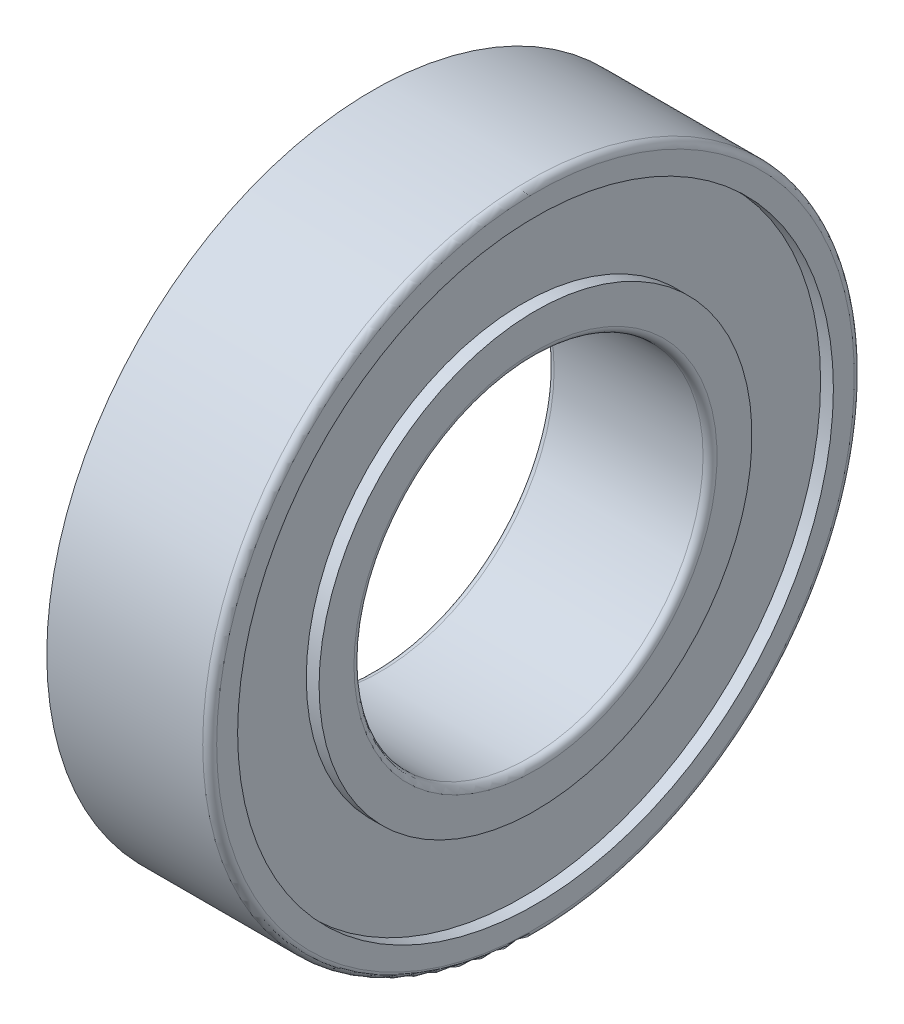
ISO-10303-21;
HEADER;
FILE_DESCRIPTION(('STEP AP214'),'2;1');
FILE_NAME('part.step','',(''),(''),'','','');
FILE_SCHEMA(('AUTOMOTIVE_DESIGN { 1 0 10303 214 1 1 1 1 }'));
ENDSEC;
DATA;
#1=APPLICATION_CONTEXT('core data for automotive mechanical design processes');
#2=APPLICATION_PROTOCOL_DEFINITION('international standard','automotive_design',2000,#1);
#3=PRODUCT_CONTEXT('',#1,'mechanical');
#4=PRODUCT('Part','Part','',(#3));
#5=PRODUCT_RELATED_PRODUCT_CATEGORY('part','',(#4));
#6=PRODUCT_DEFINITION_FORMATION('','',#4);
#7=PRODUCT_DEFINITION_CONTEXT('part definition',#1,'design');
#8=PRODUCT_DEFINITION('design','',#6,#7);
#9=PRODUCT_DEFINITION_SHAPE('','',#8);
#10=(LENGTH_UNIT() NAMED_UNIT(*) SI_UNIT(.MILLI.,.METRE.));
#11=(NAMED_UNIT(*) PLANE_ANGLE_UNIT() SI_UNIT($,.RADIAN.));
#12=(NAMED_UNIT(*) SI_UNIT($,.STERADIAN.) SOLID_ANGLE_UNIT());
#13=UNCERTAINTY_MEASURE_WITH_UNIT(LENGTH_MEASURE(1.E-05),#10,'distance_accuracy_value','');
#14=(GEOMETRIC_REPRESENTATION_CONTEXT(3) GLOBAL_UNCERTAINTY_ASSIGNED_CONTEXT((#13)) GLOBAL_UNIT_ASSIGNED_CONTEXT((#10,
#11,#12)) REPRESENTATION_CONTEXT('',''));
#15=CARTESIAN_POINT('',(0.,0.,0.));
#16=DIRECTION('',(0.,0.,1.));
#17=DIRECTION('',(1.,0.,0.));
#18=AXIS2_PLACEMENT_3D('',#15,#16,#17);
#19=CARTESIAN_POINT('',(7.,0.,0.));
#20=DIRECTION('',(-1.,0.,0.));
#21=DIRECTION('',(0.,0.,1.));
#22=AXIS2_PLACEMENT_3D('',#19,#20,#21);
#23=CYLINDRICAL_SURFACE('',#22,14.);
#24=CARTESIAN_POINT('',(0.,0.,0.));
#25=DIRECTION('',(-1.,0.,0.));
#26=DIRECTION('',(0.,0.,1.));
#27=AXIS2_PLACEMENT_3D('',#24,#25,#26);
#28=CIRCLE('',#27,14.);
#29=CARTESIAN_POINT('',(0.,0.,14.));
#30=VERTEX_POINT('',#29);
#31=EDGE_CURVE('E10',#30,#30,#28,.T.);
#32=ORIENTED_EDGE('',*,*,#31,.F.);
#33=EDGE_LOOP('',(#32));
#34=FACE_BOUND('',#33,.T.);
#35=CARTESIAN_POINT('',(6.7,0.,0.));
#36=DIRECTION('',(-1.,0.,0.));
#37=DIRECTION('',(0.,0.,1.));
#38=AXIS2_PLACEMENT_3D('',#35,#36,#37);
#39=CIRCLE('',#38,14.);
#40=CARTESIAN_POINT('',(6.7,0.,14.));
#41=VERTEX_POINT('',#40);
#42=EDGE_CURVE('E88',#41,#41,#39,.T.);
#43=ORIENTED_EDGE('',*,*,#42,.T.);
#44=EDGE_LOOP('',(#43));
#45=FACE_BOUND('',#44,.T.);
#46=ADVANCED_FACE('F39',(#34,#45),#23,.T.);
#47=CARTESIAN_POINT('',(0.,14.,0.));
#48=DIRECTION('',(1.,0.,0.));
#49=DIRECTION('',(0.,0.,-1.));
#50=AXIS2_PLACEMENT_3D('',#47,#48,#49);
#51=PLANE('',#50);
#52=CARTESIAN_POINT('',(0.,0.,0.));
#53=DIRECTION('',(-1.,0.,0.));
#54=DIRECTION('',(0.,0.,1.));
#55=AXIS2_PLACEMENT_3D('',#52,#53,#54);
#56=CIRCLE('',#55,12.8);
#57=CARTESIAN_POINT('',(0.,0.,12.8));
#58=VERTEX_POINT('',#57);
#59=EDGE_CURVE('E44',#58,#58,#56,.T.);
#60=ORIENTED_EDGE('',*,*,#59,.F.);
#61=EDGE_LOOP('',(#60));
#62=FACE_BOUND('',#61,.T.);
#63=ORIENTED_EDGE('',*,*,#31,.T.);
#64=EDGE_LOOP('',(#63));
#65=FACE_BOUND('',#64,.T.);
#66=ADVANCED_FACE('F167',(#62,#65),#51,.F.);
#67=CARTESIAN_POINT('',(7.,0.,0.));
#68=DIRECTION('',(-1.,0.,0.));
#69=DIRECTION('',(0.,0.,1.));
#70=AXIS2_PLACEMENT_3D('',#67,#68,#69);
#71=CYLINDRICAL_SURFACE('',#70,12.8);
#72=CARTESIAN_POINT('',(0.55,0.,0.));
#73=DIRECTION('',(-1.,0.,0.));
#74=DIRECTION('',(0.,0.,1.));
#75=AXIS2_PLACEMENT_3D('',#72,#73,#74);
#76=CIRCLE('',#75,12.8);
#77=CARTESIAN_POINT('',(0.55,0.,12.8));
#78=VERTEX_POINT('',#77);
#79=EDGE_CURVE('E47',#78,#78,#76,.T.);
#80=ORIENTED_EDGE('',*,*,#79,.F.);
#81=EDGE_LOOP('',(#80));
#82=FACE_BOUND('',#81,.T.);
#83=ORIENTED_EDGE('',*,*,#59,.T.);
#84=EDGE_LOOP('',(#83));
#85=FACE_BOUND('',#84,.T.);
#86=ADVANCED_FACE('F164',(#82,#85),#71,.F.);
#87=CARTESIAN_POINT('',(0.55,12.8,0.));
#88=DIRECTION('',(1.,0.,0.));
#89=DIRECTION('',(0.,0.,-1.));
#90=AXIS2_PLACEMENT_3D('',#87,#88,#89);
#91=PLANE('',#90);
#92=CARTESIAN_POINT('',(0.55,0.,0.));
#93=DIRECTION('',(-1.,0.,0.));
#94=DIRECTION('',(0.,0.,1.));
#95=AXIS2_PLACEMENT_3D('',#92,#93,#94);
#96=CIRCLE('',#95,9.3);
#97=CARTESIAN_POINT('',(0.55,0.,9.3));
#98=VERTEX_POINT('',#97);
#99=EDGE_CURVE('E52',#98,#98,#96,.T.);
#100=ORIENTED_EDGE('',*,*,#99,.F.);
#101=EDGE_LOOP('',(#100));
#102=FACE_BOUND('',#101,.T.);
#103=ORIENTED_EDGE('',*,*,#79,.T.);
#104=EDGE_LOOP('',(#103));
#105=FACE_BOUND('',#104,.T.);
#106=ADVANCED_FACE('F157',(#102,#105),#91,.F.);
#107=CARTESIAN_POINT('',(7.,0.,0.));
#108=DIRECTION('',(-1.,0.,0.));
#109=DIRECTION('',(0.,0.,1.));
#110=AXIS2_PLACEMENT_3D('',#107,#108,#109);
#111=CYLINDRICAL_SURFACE('',#110,9.3);
#112=CARTESIAN_POINT('',(0.,0.,0.));
#113=DIRECTION('',(-1.,0.,0.));
#114=DIRECTION('',(0.,0.,1.));
#115=AXIS2_PLACEMENT_3D('',#112,#113,#114);
#116=CIRCLE('',#115,9.3);
#117=CARTESIAN_POINT('',(0.,0.,9.3));
#118=VERTEX_POINT('',#117);
#119=EDGE_CURVE('E59',#118,#118,#116,.T.);
#120=ORIENTED_EDGE('',*,*,#119,.F.);
#121=EDGE_LOOP('',(#120));
#122=FACE_BOUND('',#121,.T.);
#123=ORIENTED_EDGE('',*,*,#99,.T.);
#124=EDGE_LOOP('',(#123));
#125=FACE_BOUND('',#124,.T.);
#126=ADVANCED_FACE('F148',(#122,#125),#111,.T.);
#127=CARTESIAN_POINT('',(0.,9.3,0.));
#128=DIRECTION('',(1.,0.,0.));
#129=DIRECTION('',(0.,0.,-1.));
#130=AXIS2_PLACEMENT_3D('',#127,#128,#129);
#131=PLANE('',#130);
#132=CARTESIAN_POINT('',(0.,0.,0.));
#133=DIRECTION('',(-1.,0.,0.));
#134=DIRECTION('',(0.,0.,1.));
#135=AXIS2_PLACEMENT_3D('',#132,#133,#134);
#136=CIRCLE('',#135,7.8);
#137=CARTESIAN_POINT('',(0.,0.,7.8));
#138=VERTEX_POINT('',#137);
#139=EDGE_CURVE('E63',#138,#138,#136,.T.);
#140=ORIENTED_EDGE('',*,*,#139,.F.);
#141=EDGE_LOOP('',(#140));
#142=FACE_BOUND('',#141,.T.);
#143=ORIENTED_EDGE('',*,*,#119,.T.);
#144=EDGE_LOOP('',(#143));
#145=FACE_BOUND('',#144,.T.);
#146=ADVANCED_FACE('F143',(#142,#145),#131,.F.);
#147=CARTESIAN_POINT('',(0.300000000000002,0.,0.));
#148=DIRECTION('',(-1.,0.,0.));
#149=DIRECTION('',(0.,0.,1.));
#150=AXIS2_PLACEMENT_3D('',#147,#148,#149);
#151=TOROIDAL_SURFACE('',#150,7.8,0.300000000000002);
#152=CARTESIAN_POINT('',(0.3,0.,0.));
#153=DIRECTION('',(-1.,0.,0.));
#154=DIRECTION('',(0.,0.,1.));
#155=AXIS2_PLACEMENT_3D('',#152,#153,#154);
#156=CIRCLE('',#155,7.5);
#157=CARTESIAN_POINT('',(0.3,0.,7.5));
#158=VERTEX_POINT('',#157);
#159=EDGE_CURVE('E65',#158,#158,#156,.T.);
#160=ORIENTED_EDGE('',*,*,#159,.F.);
#161=EDGE_LOOP('',(#160));
#162=FACE_BOUND('',#161,.T.);
#163=ORIENTED_EDGE('',*,*,#139,.T.);
#164=EDGE_LOOP('',(#163));
#165=FACE_BOUND('',#164,.T.);
#166=ADVANCED_FACE('F138',(#162,#165),#151,.T.);
#167=CARTESIAN_POINT('',(7.,0.,0.));
#168=DIRECTION('',(-1.,0.,0.));
#169=DIRECTION('',(0.,0.,1.));
#170=AXIS2_PLACEMENT_3D('',#167,#168,#169);
#171=CYLINDRICAL_SURFACE('',#170,7.5);
#172=CARTESIAN_POINT('',(6.7,0.,0.));
#173=DIRECTION('',(-1.,0.,0.));
#174=DIRECTION('',(0.,0.,1.));
#175=AXIS2_PLACEMENT_3D('',#172,#173,#174);
#176=CIRCLE('',#175,7.5);
#177=CARTESIAN_POINT('',(6.7,0.,7.5));
#178=VERTEX_POINT('',#177);
#179=EDGE_CURVE('E70',#178,#178,#176,.T.);
#180=ORIENTED_EDGE('',*,*,#179,.F.);
#181=EDGE_LOOP('',(#180));
#182=FACE_BOUND('',#181,.T.);
#183=ORIENTED_EDGE('',*,*,#159,.T.);
#184=EDGE_LOOP('',(#183));
#185=FACE_BOUND('',#184,.T.);
#186=ADVANCED_FACE('F135',(#182,#185),#171,.F.);
#187=CARTESIAN_POINT('',(6.7,0.,0.));
#188=DIRECTION('',(-1.,0.,0.));
#189=DIRECTION('',(0.,0.,1.));
#190=AXIS2_PLACEMENT_3D('',#187,#188,#189);
#191=TOROIDAL_SURFACE('',#190,7.8,0.299999999999999);
#192=CARTESIAN_POINT('',(7.,0.,0.));
#193=DIRECTION('',(-1.,0.,0.));
#194=DIRECTION('',(0.,0.,1.));
#195=AXIS2_PLACEMENT_3D('',#192,#193,#194);
#196=CIRCLE('',#195,7.8);
#197=CARTESIAN_POINT('',(7.,0.,7.8));
#198=VERTEX_POINT('',#197);
#199=EDGE_CURVE('E68',#198,#198,#196,.T.);
#200=ORIENTED_EDGE('',*,*,#199,.F.);
#201=EDGE_LOOP('',(#200));
#202=FACE_BOUND('',#201,.T.);
#203=ORIENTED_EDGE('',*,*,#179,.T.);
#204=EDGE_LOOP('',(#203));
#205=FACE_BOUND('',#204,.T.);
#206=ADVANCED_FACE('F128',(#202,#205),#191,.T.);
#207=CARTESIAN_POINT('',(7.,7.8,0.));
#208=DIRECTION('',(-1.,0.,0.));
#209=DIRECTION('',(0.,0.,1.));
#210=AXIS2_PLACEMENT_3D('',#207,#208,#209);
#211=PLANE('',#210);
#212=CARTESIAN_POINT('',(7.,0.,0.));
#213=DIRECTION('',(-1.,0.,0.));
#214=DIRECTION('',(0.,0.,1.));
#215=AXIS2_PLACEMENT_3D('',#212,#213,#214);
#216=CIRCLE('',#215,9.3);
#217=CARTESIAN_POINT('',(7.,0.,9.3));
#218=VERTEX_POINT('',#217);
#219=EDGE_CURVE('E72',#218,#218,#216,.T.);
#220=ORIENTED_EDGE('',*,*,#219,.F.);
#221=EDGE_LOOP('',(#220));
#222=FACE_BOUND('',#221,.T.);
#223=ORIENTED_EDGE('',*,*,#199,.T.);
#224=EDGE_LOOP('',(#223));
#225=FACE_BOUND('',#224,.T.);
#226=ADVANCED_FACE('F116',(#222,#225),#211,.F.);
#227=CARTESIAN_POINT('',(7.,0.,0.));
#228=DIRECTION('',(-1.,0.,0.));
#229=DIRECTION('',(0.,0.,1.));
#230=AXIS2_PLACEMENT_3D('',#227,#228,#229);
#231=CYLINDRICAL_SURFACE('',#230,9.3);
#232=CARTESIAN_POINT('',(6.45,0.,0.));
#233=DIRECTION('',(-1.,0.,0.));
#234=DIRECTION('',(0.,0.,1.));
#235=AXIS2_PLACEMENT_3D('',#232,#233,#234);
#236=CIRCLE('',#235,9.3);
#237=CARTESIAN_POINT('',(6.45,0.,9.3));
#238=VERTEX_POINT('',#237);
#239=EDGE_CURVE('E78',#238,#238,#236,.T.);
#240=ORIENTED_EDGE('',*,*,#239,.F.);
#241=EDGE_LOOP('',(#240));
#242=FACE_BOUND('',#241,.T.);
#243=ORIENTED_EDGE('',*,*,#219,.T.);
#244=EDGE_LOOP('',(#243));
#245=FACE_BOUND('',#244,.T.);
#246=ADVANCED_FACE('F114',(#242,#245),#231,.T.);
#247=CARTESIAN_POINT('',(6.45,9.3,0.));
#248=DIRECTION('',(-1.,0.,0.));
#249=DIRECTION('',(0.,0.,1.));
#250=AXIS2_PLACEMENT_3D('',#247,#248,#249);
#251=PLANE('',#250);
#252=CARTESIAN_POINT('',(6.45,0.,0.));
#253=DIRECTION('',(-1.,0.,0.));
#254=DIRECTION('',(0.,0.,1.));
#255=AXIS2_PLACEMENT_3D('',#252,#253,#254);
#256=CIRCLE('',#255,12.8);
#257=CARTESIAN_POINT('',(6.45,0.,12.8));
#258=VERTEX_POINT('',#257);
#259=EDGE_CURVE('E80',#258,#258,#256,.T.);
#260=ORIENTED_EDGE('',*,*,#259,.F.);
#261=EDGE_LOOP('',(#260));
#262=FACE_BOUND('',#261,.T.);
#263=ORIENTED_EDGE('',*,*,#239,.T.);
#264=EDGE_LOOP('',(#263));
#265=FACE_BOUND('',#264,.T.);
#266=ADVANCED_FACE('F107',(#262,#265),#251,.F.);
#267=CARTESIAN_POINT('',(7.,0.,0.));
#268=DIRECTION('',(-1.,0.,0.));
#269=DIRECTION('',(0.,0.,1.));
#270=AXIS2_PLACEMENT_3D('',#267,#268,#269);
#271=CYLINDRICAL_SURFACE('',#270,12.8);
#272=CARTESIAN_POINT('',(7.,0.,0.));
#273=DIRECTION('',(-1.,0.,0.));
#274=DIRECTION('',(0.,0.,1.));
#275=AXIS2_PLACEMENT_3D('',#272,#273,#274);
#276=CIRCLE('',#275,12.8);
#277=CARTESIAN_POINT('',(7.,0.,12.8));
#278=VERTEX_POINT('',#277);
#279=EDGE_CURVE('E85',#278,#278,#276,.T.);
#280=ORIENTED_EDGE('',*,*,#279,.F.);
#281=EDGE_LOOP('',(#280));
#282=FACE_BOUND('',#281,.T.);
#283=ORIENTED_EDGE('',*,*,#259,.T.);
#284=EDGE_LOOP('',(#283));
#285=FACE_BOUND('',#284,.T.);
#286=ADVANCED_FACE('F105',(#282,#285),#271,.F.);
#287=CARTESIAN_POINT('',(7.,12.8,0.));
#288=DIRECTION('',(-1.,0.,0.));
#289=DIRECTION('',(0.,0.,1.));
#290=AXIS2_PLACEMENT_3D('',#287,#288,#289);
#291=PLANE('',#290);
#292=CARTESIAN_POINT('',(7.,0.,0.));
#293=DIRECTION('',(-1.,0.,0.));
#294=DIRECTION('',(0.,0.,1.));
#295=AXIS2_PLACEMENT_3D('',#292,#293,#294);
#296=CIRCLE('',#295,13.7);
#297=CARTESIAN_POINT('',(7.,0.,13.7));
#298=VERTEX_POINT('',#297);
#299=EDGE_CURVE('E82',#298,#298,#296,.T.);
#300=ORIENTED_EDGE('',*,*,#299,.F.);
#301=EDGE_LOOP('',(#300));
#302=FACE_BOUND('',#301,.T.);
#303=ORIENTED_EDGE('',*,*,#279,.T.);
#304=EDGE_LOOP('',(#303));
#305=FACE_BOUND('',#304,.T.);
#306=ADVANCED_FACE('F96',(#302,#305),#291,.F.);
#307=CARTESIAN_POINT('',(6.7,0.,0.));
#308=DIRECTION('',(-1.,0.,0.));
#309=DIRECTION('',(0.,0.,1.));
#310=AXIS2_PLACEMENT_3D('',#307,#308,#309);
#311=TOROIDAL_SURFACE('',#310,13.7,0.300000000000003);
#312=ORIENTED_EDGE('',*,*,#42,.F.);
#313=EDGE_LOOP('',(#312));
#314=FACE_BOUND('',#313,.T.);
#315=ORIENTED_EDGE('',*,*,#299,.T.);
#316=EDGE_LOOP('',(#315));
#317=FACE_BOUND('',#316,.T.);
#318=ADVANCED_FACE('F93',(#314,#317),#311,.T.);
#319=CLOSED_SHELL('',(#46,#66,#86,#106,#126,#146,#166,#186,#206,#226,#246,#266,#286,#306,#318));
#320=MANIFOLD_SOLID_BREP('B2',#319);
#321=ADVANCED_BREP_SHAPE_REPRESENTATION('',(#18,#320),#14);
#322=SHAPE_DEFINITION_REPRESENTATION(#9,#321);
ENDSEC;
END-ISO-10303-21;
